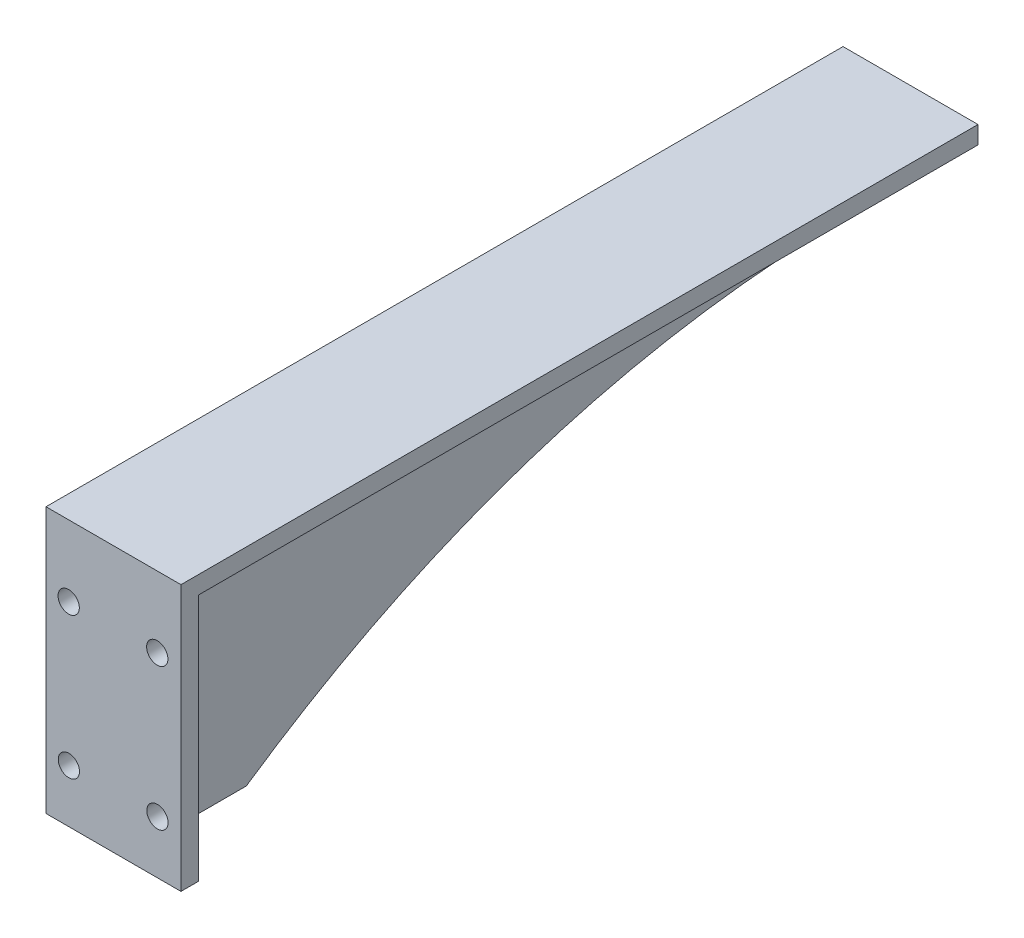
ISO-10303-21;
HEADER;
FILE_DESCRIPTION(('STEP AP214'),'2;1');
FILE_NAME('part.step','',(''),(''),'','','');
FILE_SCHEMA(('AUTOMOTIVE_DESIGN { 1 0 10303 214 1 1 1 1 }'));
ENDSEC;
DATA;
#1=APPLICATION_CONTEXT('core data for automotive mechanical design processes');
#2=APPLICATION_PROTOCOL_DEFINITION('international standard','automotive_design',2000,#1);
#3=PRODUCT_CONTEXT('',#1,'mechanical');
#4=PRODUCT('Part','Part','',(#3));
#5=PRODUCT_RELATED_PRODUCT_CATEGORY('part','',(#4));
#6=PRODUCT_DEFINITION_FORMATION('','',#4);
#7=PRODUCT_DEFINITION_CONTEXT('part definition',#1,'design');
#8=PRODUCT_DEFINITION('design','',#6,#7);
#9=PRODUCT_DEFINITION_SHAPE('','',#8);
#10=(LENGTH_UNIT() NAMED_UNIT(*) SI_UNIT(.MILLI.,.METRE.));
#11=(NAMED_UNIT(*) PLANE_ANGLE_UNIT() SI_UNIT($,.RADIAN.));
#12=(NAMED_UNIT(*) SI_UNIT($,.STERADIAN.) SOLID_ANGLE_UNIT());
#13=UNCERTAINTY_MEASURE_WITH_UNIT(LENGTH_MEASURE(1.E-05),#10,'distance_accuracy_value','');
#14=(GEOMETRIC_REPRESENTATION_CONTEXT(3) GLOBAL_UNCERTAINTY_ASSIGNED_CONTEXT((#13)) GLOBAL_UNIT_ASSIGNED_CONTEXT((#10,
#11,#12)) REPRESENTATION_CONTEXT('',''));
#15=CARTESIAN_POINT('',(0.,0.,0.));
#16=DIRECTION('',(0.,0.,1.));
#17=DIRECTION('',(1.,0.,0.));
#18=AXIS2_PLACEMENT_3D('',#15,#16,#17);
#19=CARTESIAN_POINT('',(2.5,-70.,0.));
#20=DIRECTION('',(0.,1.,0.));
#21=DIRECTION('',(0.,0.,1.));
#22=AXIS2_PLACEMENT_3D('',#19,#20,#21);
#23=PLANE('',#22);
#24=DIRECTION('',(0.,0.,-1.));
#25=VECTOR('',#24,1.);
#26=CARTESIAN_POINT('',(-2.5,-70.,0.));
#27=LINE('',#26,#25);
#28=CARTESIAN_POINT('',(-2.5,-70.,0.));
#29=VERTEX_POINT('',#28);
#30=CARTESIAN_POINT('',(-2.5,-70.,-30.));
#31=VERTEX_POINT('',#30);
#32=EDGE_CURVE('E64',#29,#31,#27,.T.);
#33=ORIENTED_EDGE('',*,*,#32,.T.);
#34=DIRECTION('',(-1.,0.,0.));
#35=VECTOR('',#34,1.);
#36=CARTESIAN_POINT('',(2.5,-70.,-30.));
#37=LINE('',#36,#35);
#38=CARTESIAN_POINT('',(2.5,-70.,-30.));
#39=VERTEX_POINT('',#38);
#40=EDGE_CURVE('E11',#39,#31,#37,.T.);
#41=ORIENTED_EDGE('',*,*,#40,.F.);
#42=DIRECTION('',(0.,0.,-1.));
#43=VECTOR('',#42,1.);
#44=CARTESIAN_POINT('',(2.5,-70.,0.));
#45=LINE('',#44,#43);
#46=CARTESIAN_POINT('',(2.5,-70.,0.));
#47=VERTEX_POINT('',#46);
#48=EDGE_CURVE('E76',#47,#39,#45,.T.);
#49=ORIENTED_EDGE('',*,*,#48,.F.);
#50=DIRECTION('',(1.,0.,0.));
#51=VECTOR('',#50,1.);
#52=CARTESIAN_POINT('',(-19.05,-70.,0.));
#53=LINE('',#52,#51);
#54=CARTESIAN_POINT('',(19.05,-70.,0.));
#55=VERTEX_POINT('',#54);
#56=EDGE_CURVE('E404',#47,#55,#53,.T.);
#57=ORIENTED_EDGE('',*,*,#56,.T.);
#58=DIRECTION('',(0.,0.,-1.));
#59=VECTOR('',#58,1.);
#60=CARTESIAN_POINT('',(19.05,-70.,5.));
#61=LINE('',#60,#59);
#62=CARTESIAN_POINT('',(19.05,-70.,5.));
#63=VERTEX_POINT('',#62);
#64=EDGE_CURVE('E126',#63,#55,#61,.T.);
#65=ORIENTED_EDGE('',*,*,#64,.F.);
#66=DIRECTION('',(1.,0.,0.));
#67=VECTOR('',#66,1.);
#68=CARTESIAN_POINT('',(-19.05,-70.,5.));
#69=LINE('',#68,#67);
#70=CARTESIAN_POINT('',(-19.05,-70.,5.));
#71=VERTEX_POINT('',#70);
#72=EDGE_CURVE('E121',#71,#63,#69,.T.);
#73=ORIENTED_EDGE('',*,*,#72,.F.);
#74=DIRECTION('',(0.,0.,-1.));
#75=VECTOR('',#74,1.);
#76=CARTESIAN_POINT('',(-19.05,-70.,5.));
#77=LINE('',#76,#75);
#78=CARTESIAN_POINT('',(-19.05,-70.,0.));
#79=VERTEX_POINT('',#78);
#80=EDGE_CURVE('E124',#71,#79,#77,.T.);
#81=ORIENTED_EDGE('',*,*,#80,.T.);
#82=EDGE_CURVE('E403',#79,#29,#53,.T.);
#83=ORIENTED_EDGE('',*,*,#82,.T.);
#84=EDGE_LOOP('',(#33,#41,#49,#57,#65,#73,#81,#83));
#85=FACE_BOUND('',#84,.T.);
#86=ADVANCED_FACE('F33',(#85),#23,.F.);
#87=CARTESIAN_POINT('',(2.5,-70.,-30.));
#88=CARTESIAN_POINT('',(2.5,-10.835054955795,-116.610221718221));
#89=CARTESIAN_POINT('',(2.5,-16.,-220.));
#90=B_SPLINE_CURVE_WITH_KNOTS('',2,(#87,#88,#89),.UNSPECIFIED.,.F.,.F.,(3,3),(0.,1.),.UNSPECIFIED.);
#91=DIRECTION('',(-1.,0.,0.));
#92=VECTOR('',#91,1.);
#93=SURFACE_OF_LINEAR_EXTRUSION('',#90,#92);
#94=CARTESIAN_POINT('',(-2.5,-70.,-30.));
#95=CARTESIAN_POINT('',(-2.5,-10.835054955795,-116.610221718221));
#96=CARTESIAN_POINT('',(-2.5,-16.,-220.));
#97=B_SPLINE_CURVE_WITH_KNOTS('',2,(#94,#95,#96),.UNSPECIFIED.,.F.,.F.,(3,3),(0.,1.),.UNSPECIFIED.);
#98=CARTESIAN_POINT('',(-2.5,-16.,-220.));
#99=VERTEX_POINT('',#98);
#100=EDGE_CURVE('E70',#31,#99,#97,.T.);
#101=ORIENTED_EDGE('',*,*,#100,.T.);
#102=DIRECTION('',(-1.,0.,0.));
#103=VECTOR('',#102,1.);
#104=CARTESIAN_POINT('',(2.5,-16.,-220.));
#105=LINE('',#104,#103);
#106=CARTESIAN_POINT('',(2.5,-16.,-220.));
#107=VERTEX_POINT('',#106);
#108=EDGE_CURVE('E41',#107,#99,#105,.T.);
#109=ORIENTED_EDGE('',*,*,#108,.F.);
#110=EDGE_CURVE('E179',#39,#107,#90,.T.);
#111=ORIENTED_EDGE('',*,*,#110,.F.);
#112=ORIENTED_EDGE('',*,*,#40,.T.);
#113=EDGE_LOOP('',(#101,#109,#111,#112));
#114=FACE_BOUND('',#113,.T.);
#115=ADVANCED_FACE('F189',(#114),#93,.F.);
#116=CARTESIAN_POINT('',(2.5,0.,-220.));
#117=DIRECTION('',(0.,0.,1.));
#118=DIRECTION('',(1.,0.,0.));
#119=AXIS2_PLACEMENT_3D('',#116,#117,#118);
#120=PLANE('',#119);
#121=DIRECTION('',(0.,1.,0.));
#122=VECTOR('',#121,1.);
#123=CARTESIAN_POINT('',(-2.5,0.,-220.));
#124=LINE('',#123,#122);
#125=CARTESIAN_POINT('',(-2.49999999999999,0.,-220.));
#126=VERTEX_POINT('',#125);
#127=EDGE_CURVE('E381',#99,#126,#124,.T.);
#128=ORIENTED_EDGE('',*,*,#127,.T.);
#129=DIRECTION('',(-1.,0.,0.));
#130=VECTOR('',#129,1.);
#131=CARTESIAN_POINT('',(19.05,0.,-220.));
#132=LINE('',#131,#130);
#133=CARTESIAN_POINT('',(-19.05,0.,-220.));
#134=VERTEX_POINT('',#133);
#135=EDGE_CURVE('E166',#126,#134,#132,.T.);
#136=ORIENTED_EDGE('',*,*,#135,.T.);
#137=DIRECTION('',(0.,-1.,0.));
#138=VECTOR('',#137,1.);
#139=CARTESIAN_POINT('',(-19.05,5.,-220.));
#140=LINE('',#139,#138);
#141=CARTESIAN_POINT('',(-19.05,5.,-220.));
#142=VERTEX_POINT('',#141);
#143=EDGE_CURVE('E159',#142,#134,#140,.T.);
#144=ORIENTED_EDGE('',*,*,#143,.F.);
#145=DIRECTION('',(-1.,0.,0.));
#146=VECTOR('',#145,1.);
#147=CARTESIAN_POINT('',(19.05,5.,-220.));
#148=LINE('',#147,#146);
#149=CARTESIAN_POINT('',(19.05,5.,-220.));
#150=VERTEX_POINT('',#149);
#151=EDGE_CURVE('E158',#150,#142,#148,.T.);
#152=ORIENTED_EDGE('',*,*,#151,.F.);
#153=DIRECTION('',(0.,-1.,0.));
#154=VECTOR('',#153,1.);
#155=CARTESIAN_POINT('',(19.05,5.,-220.));
#156=LINE('',#155,#154);
#157=CARTESIAN_POINT('',(19.05,0.,-220.));
#158=VERTEX_POINT('',#157);
#159=EDGE_CURVE('E171',#150,#158,#156,.T.);
#160=ORIENTED_EDGE('',*,*,#159,.T.);
#161=CARTESIAN_POINT('',(2.50000000000001,0.,-220.));
#162=VERTEX_POINT('',#161);
#163=EDGE_CURVE('E156',#158,#162,#132,.T.);
#164=ORIENTED_EDGE('',*,*,#163,.T.);
#165=DIRECTION('',(0.,1.,0.));
#166=VECTOR('',#165,1.);
#167=CARTESIAN_POINT('',(2.5,0.,-220.));
#168=LINE('',#167,#166);
#169=EDGE_CURVE('E184',#107,#162,#168,.T.);
#170=ORIENTED_EDGE('',*,*,#169,.F.);
#171=ORIENTED_EDGE('',*,*,#108,.T.);
#172=EDGE_LOOP('',(#128,#136,#144,#152,#160,#164,#170,#171));
#173=FACE_BOUND('',#172,.T.);
#174=ADVANCED_FACE('F192',(#173),#120,.F.);
#175=CARTESIAN_POINT('',(2.5,-26.9175274778975,-120.80511085911));
#176=DIRECTION('',(1.,0.,0.));
#177=DIRECTION('',(0.,0.,-1.));
#178=AXIS2_PLACEMENT_3D('',#175,#176,#177);
#179=PLANE('',#178);
#180=DIRECTION('',(0.,-1.,0.));
#181=VECTOR('',#180,1.);
#182=CARTESIAN_POINT('',(2.5,0.,0.));
#183=LINE('',#182,#181);
#184=CARTESIAN_POINT('',(2.5,0.,0.));
#185=VERTEX_POINT('',#184);
#186=EDGE_CURVE('E175',#185,#47,#183,.T.);
#187=ORIENTED_EDGE('',*,*,#186,.T.);
#188=ORIENTED_EDGE('',*,*,#48,.T.);
#189=ORIENTED_EDGE('',*,*,#110,.T.);
#190=ORIENTED_EDGE('',*,*,#169,.T.);
#191=DIRECTION('',(0.,0.,1.));
#192=VECTOR('',#191,1.);
#193=CARTESIAN_POINT('',(2.5,0.,0.));
#194=LINE('',#193,#192);
#195=EDGE_CURVE('E386',#162,#185,#194,.T.);
#196=ORIENTED_EDGE('',*,*,#195,.T.);
#197=EDGE_LOOP('',(#187,#188,#189,#190,#196));
#198=FACE_BOUND('',#197,.T.);
#199=ADVANCED_FACE('F195',(#198),#179,.T.);
#200=CARTESIAN_POINT('',(-2.5,-26.9175274778975,-120.80511085911));
#201=DIRECTION('',(1.,0.,0.));
#202=DIRECTION('',(0.,0.,-1.));
#203=AXIS2_PLACEMENT_3D('',#200,#201,#202);
#204=PLANE('',#203);
#205=DIRECTION('',(0.,-1.,0.));
#206=VECTOR('',#205,1.);
#207=CARTESIAN_POINT('',(-2.5,0.,0.));
#208=LINE('',#207,#206);
#209=CARTESIAN_POINT('',(-2.50000000000001,0.,0.));
#210=VERTEX_POINT('',#209);
#211=EDGE_CURVE('E174',#210,#29,#208,.T.);
#212=ORIENTED_EDGE('',*,*,#211,.F.);
#213=DIRECTION('',(0.,0.,1.));
#214=VECTOR('',#213,1.);
#215=CARTESIAN_POINT('',(-2.5,0.,0.));
#216=LINE('',#215,#214);
#217=EDGE_CURVE('E177',#126,#210,#216,.T.);
#218=ORIENTED_EDGE('',*,*,#217,.F.);
#219=ORIENTED_EDGE('',*,*,#127,.F.);
#220=ORIENTED_EDGE('',*,*,#100,.F.);
#221=ORIENTED_EDGE('',*,*,#32,.F.);
#222=EDGE_LOOP('',(#212,#218,#219,#220,#221));
#223=FACE_BOUND('',#222,.T.);
#224=ADVANCED_FACE('F197',(#223),#204,.F.);
#225=CARTESIAN_POINT('',(0.,0.,0.));
#226=DIRECTION('',(0.,1.,0.));
#227=DIRECTION('',(0.,0.,1.));
#228=AXIS2_PLACEMENT_3D('',#225,#226,#227);
#229=PLANE('',#228);
#230=ORIENTED_EDGE('',*,*,#135,.F.);
#231=ORIENTED_EDGE('',*,*,#217,.T.);
#232=DIRECTION('',(1.,0.,0.));
#233=VECTOR('',#232,1.);
#234=CARTESIAN_POINT('',(-19.05,0.,0.));
#235=LINE('',#234,#233);
#236=CARTESIAN_POINT('',(-19.05,0.,0.));
#237=VERTEX_POINT('',#236);
#238=EDGE_CURVE('E161',#237,#210,#235,.T.);
#239=ORIENTED_EDGE('',*,*,#238,.F.);
#240=DIRECTION('',(0.,0.,1.));
#241=VECTOR('',#240,1.);
#242=CARTESIAN_POINT('',(-19.05,0.,0.));
#243=LINE('',#242,#241);
#244=EDGE_CURVE('E147',#134,#237,#243,.T.);
#245=ORIENTED_EDGE('',*,*,#244,.F.);
#246=EDGE_LOOP('',(#230,#231,#239,#245));
#247=FACE_BOUND('',#246,.T.);
#248=ADVANCED_FACE('F200',(#247),#229,.F.);
#249=CARTESIAN_POINT('',(-19.05,5.,0.));
#250=DIRECTION('',(1.,0.,0.));
#251=DIRECTION('',(0.,0.,-1.));
#252=AXIS2_PLACEMENT_3D('',#249,#250,#251);
#253=PLANE('',#252);
#254=ORIENTED_EDGE('',*,*,#244,.T.);
#255=DIRECTION('',(0.,-1.,0.));
#256=VECTOR('',#255,1.);
#257=CARTESIAN_POINT('',(-19.05,5.,0.));
#258=LINE('',#257,#256);
#259=EDGE_CURVE('E145',#237,#79,#258,.T.);
#260=ORIENTED_EDGE('',*,*,#259,.T.);
#261=ORIENTED_EDGE('',*,*,#80,.F.);
#262=DIRECTION('',(0.,-1.,0.));
#263=VECTOR('',#262,1.);
#264=CARTESIAN_POINT('',(-19.05,5.,5.));
#265=LINE('',#264,#263);
#266=CARTESIAN_POINT('',(-19.05,5.,5.));
#267=VERTEX_POINT('',#266);
#268=EDGE_CURVE('E131',#267,#71,#265,.T.);
#269=ORIENTED_EDGE('',*,*,#268,.F.);
#270=DIRECTION('',(0.,0.,1.));
#271=VECTOR('',#270,1.);
#272=CARTESIAN_POINT('',(-19.05,5.,0.));
#273=LINE('',#272,#271);
#274=EDGE_CURVE('E153',#142,#267,#273,.T.);
#275=ORIENTED_EDGE('',*,*,#274,.F.);
#276=ORIENTED_EDGE('',*,*,#143,.T.);
#277=EDGE_LOOP('',(#254,#260,#261,#269,#275,#276));
#278=FACE_BOUND('',#277,.T.);
#279=ADVANCED_FACE('F143',(#278),#253,.F.);
#280=CARTESIAN_POINT('',(19.05,5.,0.));
#281=DIRECTION('',(-1.,0.,0.));
#282=DIRECTION('',(0.,0.,1.));
#283=AXIS2_PLACEMENT_3D('',#280,#281,#282);
#284=PLANE('',#283);
#285=DIRECTION('',(0.,0.,-1.));
#286=VECTOR('',#285,1.);
#287=CARTESIAN_POINT('',(19.05,0.,0.));
#288=LINE('',#287,#286);
#289=CARTESIAN_POINT('',(19.05,0.,0.));
#290=VERTEX_POINT('',#289);
#291=EDGE_CURVE('E164',#290,#158,#288,.T.);
#292=ORIENTED_EDGE('',*,*,#291,.T.);
#293=ORIENTED_EDGE('',*,*,#159,.F.);
#294=DIRECTION('',(0.,0.,-1.));
#295=VECTOR('',#294,1.);
#296=CARTESIAN_POINT('',(19.05,5.,0.));
#297=LINE('',#296,#295);
#298=CARTESIAN_POINT('',(19.05,5.,5.));
#299=VERTEX_POINT('',#298);
#300=EDGE_CURVE('E155',#299,#150,#297,.T.);
#301=ORIENTED_EDGE('',*,*,#300,.F.);
#302=DIRECTION('',(0.,1.,0.));
#303=VECTOR('',#302,1.);
#304=CARTESIAN_POINT('',(19.05,5.,5.));
#305=LINE('',#304,#303);
#306=EDGE_CURVE('E130',#63,#299,#305,.T.);
#307=ORIENTED_EDGE('',*,*,#306,.F.);
#308=ORIENTED_EDGE('',*,*,#64,.T.);
#309=DIRECTION('',(0.,1.,0.));
#310=VECTOR('',#309,1.);
#311=CARTESIAN_POINT('',(19.05,5.,0.));
#312=LINE('',#311,#310);
#313=EDGE_CURVE('E140',#55,#290,#312,.T.);
#314=ORIENTED_EDGE('',*,*,#313,.T.);
#315=EDGE_LOOP('',(#292,#293,#301,#307,#308,#314));
#316=FACE_BOUND('',#315,.T.);
#317=ADVANCED_FACE('F207',(#316),#284,.F.);
#318=CARTESIAN_POINT('',(0.,5.,0.));
#319=DIRECTION('',(0.,1.,0.));
#320=DIRECTION('',(0.,0.,1.));
#321=AXIS2_PLACEMENT_3D('',#318,#319,#320);
#322=PLANE('',#321);
#323=ORIENTED_EDGE('',*,*,#274,.T.);
#324=DIRECTION('',(-1.,0.,0.));
#325=VECTOR('',#324,1.);
#326=CARTESIAN_POINT('',(-19.05,5.,5.));
#327=LINE('',#326,#325);
#328=EDGE_CURVE('E137',#299,#267,#327,.T.);
#329=ORIENTED_EDGE('',*,*,#328,.F.);
#330=ORIENTED_EDGE('',*,*,#300,.T.);
#331=ORIENTED_EDGE('',*,*,#151,.T.);
#332=EDGE_LOOP('',(#323,#329,#330,#331));
#333=FACE_BOUND('',#332,.T.);
#334=ADVANCED_FACE('F210',(#333),#322,.T.);
#335=ORIENTED_EDGE('',*,*,#195,.F.);
#336=ORIENTED_EDGE('',*,*,#163,.F.);
#337=ORIENTED_EDGE('',*,*,#291,.F.);
#338=EDGE_CURVE('E49',#185,#290,#235,.T.);
#339=ORIENTED_EDGE('',*,*,#338,.F.);
#340=EDGE_LOOP('',(#335,#336,#337,#339));
#341=FACE_BOUND('',#340,.T.);
#342=ADVANCED_FACE('F212',(#341),#229,.F.);
#343=CARTESIAN_POINT('',(0.,0.,0.));
#344=DIRECTION('',(0.,0.,1.));
#345=DIRECTION('',(1.,0.,0.));
#346=AXIS2_PLACEMENT_3D('',#343,#344,#345);
#347=PLANE('',#346);
#348=CARTESIAN_POINT('',(-12.5950155656691,-55.0362777368817,0.));
#349=DIRECTION('',(0.,0.,1.));
#350=DIRECTION('',(1.,0.,0.));
#351=AXIS2_PLACEMENT_3D('',#348,#349,#350);
#352=CIRCLE('',#351,3.);
#353=CARTESIAN_POINT('',(-9.59501556566913,-55.0362777368817,0.));
#354=VERTEX_POINT('',#353);
#355=EDGE_CURVE('E368',#354,#354,#352,.T.);
#356=ORIENTED_EDGE('',*,*,#355,.T.);
#357=EDGE_LOOP('',(#356));
#358=FACE_BOUND('',#357,.T.);
#359=CARTESIAN_POINT('',(-12.6457259326863,-15.0363098811611,0.));
#360=DIRECTION('',(0.,0.,1.));
#361=DIRECTION('',(1.,0.,0.));
#362=AXIS2_PLACEMENT_3D('',#359,#360,#361);
#363=CIRCLE('',#362,3.);
#364=CARTESIAN_POINT('',(-9.64572593268629,-15.0363098811611,0.));
#365=VERTEX_POINT('',#364);
#366=EDGE_CURVE('E372',#365,#365,#363,.T.);
#367=ORIENTED_EDGE('',*,*,#366,.T.);
#368=EDGE_LOOP('',(#367));
#369=FACE_BOUND('',#368,.T.);
#370=ORIENTED_EDGE('',*,*,#238,.T.);
#371=ORIENTED_EDGE('',*,*,#211,.T.);
#372=ORIENTED_EDGE('',*,*,#82,.F.);
#373=ORIENTED_EDGE('',*,*,#259,.F.);
#374=EDGE_LOOP('',(#370,#371,#372,#373));
#375=FACE_BOUND('',#374,.T.);
#376=ADVANCED_FACE('F215',(#358,#369,#375),#347,.F.);
#377=CARTESIAN_POINT('',(0.,0.,5.));
#378=DIRECTION('',(0.,0.,1.));
#379=DIRECTION('',(1.,0.,0.));
#380=AXIS2_PLACEMENT_3D('',#377,#378,#379);
#381=PLANE('',#380);
#382=CARTESIAN_POINT('',(12.3542740673137,-15.0363098811611,5.));
#383=DIRECTION('',(0.,0.,1.));
#384=DIRECTION('',(1.,0.,0.));
#385=AXIS2_PLACEMENT_3D('',#382,#383,#384);
#386=CIRCLE('',#385,3.);
#387=CARTESIAN_POINT('',(15.3542740673137,-15.0363098811611,5.));
#388=VERTEX_POINT('',#387);
#389=EDGE_CURVE('E425',#388,#388,#386,.T.);
#390=ORIENTED_EDGE('',*,*,#389,.F.);
#391=EDGE_LOOP('',(#390));
#392=FACE_BOUND('',#391,.T.);
#393=CARTESIAN_POINT('',(-12.5950155656691,-55.0362777368817,5.));
#394=DIRECTION('',(0.,0.,1.));
#395=DIRECTION('',(1.,0.,0.));
#396=AXIS2_PLACEMENT_3D('',#393,#394,#395);
#397=CIRCLE('',#396,3.);
#398=CARTESIAN_POINT('',(-9.59501556566913,-55.0362777368817,5.));
#399=VERTEX_POINT('',#398);
#400=EDGE_CURVE('E421',#399,#399,#397,.T.);
#401=ORIENTED_EDGE('',*,*,#400,.F.);
#402=EDGE_LOOP('',(#401));
#403=FACE_BOUND('',#402,.T.);
#404=CARTESIAN_POINT('',(12.4049844343309,-55.0362777368817,5.));
#405=DIRECTION('',(0.,0.,1.));
#406=DIRECTION('',(1.,0.,0.));
#407=AXIS2_PLACEMENT_3D('',#404,#405,#406);
#408=CIRCLE('',#407,3.);
#409=CARTESIAN_POINT('',(15.4049844343309,-55.0362777368817,5.));
#410=VERTEX_POINT('',#409);
#411=EDGE_CURVE('E415',#410,#410,#408,.T.);
#412=ORIENTED_EDGE('',*,*,#411,.F.);
#413=EDGE_LOOP('',(#412));
#414=FACE_BOUND('',#413,.T.);
#415=CARTESIAN_POINT('',(-12.6457259326863,-15.0363098811611,5.));
#416=DIRECTION('',(0.,0.,1.));
#417=DIRECTION('',(1.,0.,0.));
#418=AXIS2_PLACEMENT_3D('',#415,#416,#417);
#419=CIRCLE('',#418,3.);
#420=CARTESIAN_POINT('',(-9.64572593268629,-15.0363098811611,5.));
#421=VERTEX_POINT('',#420);
#422=EDGE_CURVE('E410',#421,#421,#419,.T.);
#423=ORIENTED_EDGE('',*,*,#422,.F.);
#424=EDGE_LOOP('',(#423));
#425=FACE_BOUND('',#424,.T.);
#426=ORIENTED_EDGE('',*,*,#268,.T.);
#427=ORIENTED_EDGE('',*,*,#72,.T.);
#428=ORIENTED_EDGE('',*,*,#306,.T.);
#429=ORIENTED_EDGE('',*,*,#328,.T.);
#430=EDGE_LOOP('',(#426,#427,#428,#429));
#431=FACE_BOUND('',#430,.T.);
#432=ADVANCED_FACE('F135',(#392,#403,#414,#425,#431),#381,.T.);
#433=CARTESIAN_POINT('',(12.3542740673137,-15.0363098811611,0.));
#434=DIRECTION('',(0.,0.,1.));
#435=DIRECTION('',(1.,0.,0.));
#436=AXIS2_PLACEMENT_3D('',#433,#434,#435);
#437=CIRCLE('',#436,3.);
#438=CARTESIAN_POINT('',(15.3542740673137,-15.0363098811611,0.));
#439=VERTEX_POINT('',#438);
#440=EDGE_CURVE('E413',#439,#439,#437,.T.);
#441=ORIENTED_EDGE('',*,*,#440,.T.);
#442=EDGE_LOOP('',(#441));
#443=FACE_BOUND('',#442,.T.);
#444=CARTESIAN_POINT('',(12.4049844343309,-55.0362777368817,0.));
#445=DIRECTION('',(0.,0.,1.));
#446=DIRECTION('',(1.,0.,0.));
#447=AXIS2_PLACEMENT_3D('',#444,#445,#446);
#448=CIRCLE('',#447,3.);
#449=CARTESIAN_POINT('',(15.4049844343309,-55.0362777368817,0.));
#450=VERTEX_POINT('',#449);
#451=EDGE_CURVE('E418',#450,#450,#448,.T.);
#452=ORIENTED_EDGE('',*,*,#451,.T.);
#453=EDGE_LOOP('',(#452));
#454=FACE_BOUND('',#453,.T.);
#455=ORIENTED_EDGE('',*,*,#186,.F.);
#456=ORIENTED_EDGE('',*,*,#338,.T.);
#457=ORIENTED_EDGE('',*,*,#313,.F.);
#458=ORIENTED_EDGE('',*,*,#56,.F.);
#459=EDGE_LOOP('',(#455,#456,#457,#458));
#460=FACE_BOUND('',#459,.T.);
#461=ADVANCED_FACE('F219',(#443,#454,#460),#347,.F.);
#462=CARTESIAN_POINT('',(-12.6457259326863,-15.0363098811611,0.));
#463=DIRECTION('',(0.,0.,1.));
#464=DIRECTION('',(1.,0.,0.));
#465=AXIS2_PLACEMENT_3D('',#462,#463,#464);
#466=CYLINDRICAL_SURFACE('',#465,3.);
#467=ORIENTED_EDGE('',*,*,#366,.F.);
#468=EDGE_LOOP('',(#467));
#469=FACE_BOUND('',#468,.T.);
#470=ORIENTED_EDGE('',*,*,#422,.T.);
#471=EDGE_LOOP('',(#470));
#472=FACE_BOUND('',#471,.T.);
#473=ADVANCED_FACE('F222',(#469,#472),#466,.F.);
#474=CARTESIAN_POINT('',(12.4049844343309,-55.0362777368817,0.));
#475=DIRECTION('',(0.,0.,1.));
#476=DIRECTION('',(1.,0.,0.));
#477=AXIS2_PLACEMENT_3D('',#474,#475,#476);
#478=CYLINDRICAL_SURFACE('',#477,3.);
#479=ORIENTED_EDGE('',*,*,#451,.F.);
#480=EDGE_LOOP('',(#479));
#481=FACE_BOUND('',#480,.T.);
#482=ORIENTED_EDGE('',*,*,#411,.T.);
#483=EDGE_LOOP('',(#482));
#484=FACE_BOUND('',#483,.T.);
#485=ADVANCED_FACE('F229',(#481,#484),#478,.F.);
#486=CARTESIAN_POINT('',(12.3542740673137,-15.0363098811611,0.));
#487=DIRECTION('',(0.,0.,1.));
#488=DIRECTION('',(1.,0.,0.));
#489=AXIS2_PLACEMENT_3D('',#486,#487,#488);
#490=CYLINDRICAL_SURFACE('',#489,3.);
#491=ORIENTED_EDGE('',*,*,#440,.F.);
#492=EDGE_LOOP('',(#491));
#493=FACE_BOUND('',#492,.T.);
#494=ORIENTED_EDGE('',*,*,#389,.T.);
#495=EDGE_LOOP('',(#494));
#496=FACE_BOUND('',#495,.T.);
#497=ADVANCED_FACE('F233',(#493,#496),#490,.F.);
#498=CARTESIAN_POINT('',(-12.5950155656691,-55.0362777368817,0.));
#499=DIRECTION('',(0.,0.,1.));
#500=DIRECTION('',(1.,0.,0.));
#501=AXIS2_PLACEMENT_3D('',#498,#499,#500);
#502=CYLINDRICAL_SURFACE('',#501,3.);
#503=ORIENTED_EDGE('',*,*,#355,.F.);
#504=EDGE_LOOP('',(#503));
#505=FACE_BOUND('',#504,.T.);
#506=ORIENTED_EDGE('',*,*,#400,.T.);
#507=EDGE_LOOP('',(#506));
#508=FACE_BOUND('',#507,.T.);
#509=ADVANCED_FACE('F235',(#505,#508),#502,.F.);
#510=CLOSED_SHELL('',(#86,#115,#174,#199,#224,#248,#279,#317,#334,#342,#376,#432,#461,#473,#485,
#497,#509));
#511=MANIFOLD_SOLID_BREP('B2',#510);
#512=ADVANCED_BREP_SHAPE_REPRESENTATION('',(#18,#511),#14);
#513=SHAPE_DEFINITION_REPRESENTATION(#9,#512);
ENDSEC;
END-ISO-10303-21;
